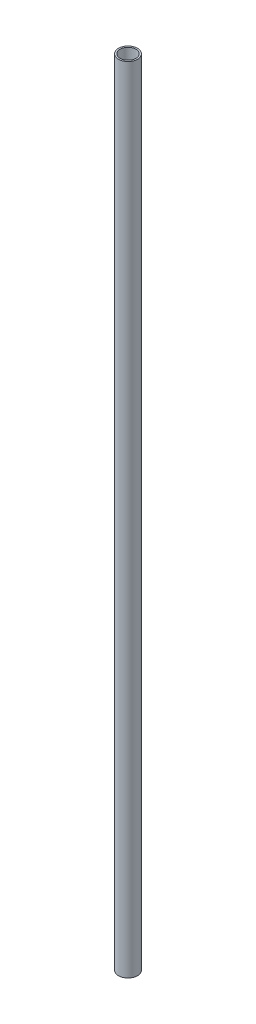
ISO-10303-21;
HEADER;
FILE_DESCRIPTION(('STEP AP214'),'2;1');
FILE_NAME('part.step','',(''),(''),'','','');
FILE_SCHEMA(('AUTOMOTIVE_DESIGN { 1 0 10303 214 1 1 1 1 }'));
ENDSEC;
DATA;
#1=APPLICATION_CONTEXT('core data for automotive mechanical design processes');
#2=APPLICATION_PROTOCOL_DEFINITION('international standard','automotive_design',2000,#1);
#3=PRODUCT_CONTEXT('',#1,'mechanical');
#4=PRODUCT('Part','Part','',(#3));
#5=PRODUCT_RELATED_PRODUCT_CATEGORY('part','',(#4));
#6=PRODUCT_DEFINITION_FORMATION('','',#4);
#7=PRODUCT_DEFINITION_CONTEXT('part definition',#1,'design');
#8=PRODUCT_DEFINITION('design','',#6,#7);
#9=PRODUCT_DEFINITION_SHAPE('','',#8);
#10=(LENGTH_UNIT() NAMED_UNIT(*) SI_UNIT(.MILLI.,.METRE.));
#11=(NAMED_UNIT(*) PLANE_ANGLE_UNIT() SI_UNIT($,.RADIAN.));
#12=(NAMED_UNIT(*) SI_UNIT($,.STERADIAN.) SOLID_ANGLE_UNIT());
#13=UNCERTAINTY_MEASURE_WITH_UNIT(LENGTH_MEASURE(1.E-05),#10,'distance_accuracy_value','');
#14=(GEOMETRIC_REPRESENTATION_CONTEXT(3) GLOBAL_UNCERTAINTY_ASSIGNED_CONTEXT((#13)) GLOBAL_UNIT_ASSIGNED_CONTEXT((#10,
#11,#12)) REPRESENTATION_CONTEXT('',''));
#15=CARTESIAN_POINT('',(0.,0.,0.));
#16=DIRECTION('',(0.,0.,1.));
#17=DIRECTION('',(1.,0.,0.));
#18=AXIS2_PLACEMENT_3D('',#15,#16,#17);
#19=CARTESIAN_POINT('',(0.,500.,0.));
#20=DIRECTION('',(0.,1.,0.));
#21=DIRECTION('',(0.,0.,1.));
#22=AXIS2_PLACEMENT_3D('',#19,#20,#21);
#23=PLANE('',#22);
#24=CARTESIAN_POINT('',(0.,500.,0.));
#25=DIRECTION('',(0.,1.,0.));
#26=DIRECTION('',(0.,0.,1.));
#27=AXIS2_PLACEMENT_3D('',#24,#25,#26);
#28=CIRCLE('',#27,6.);
#29=CARTESIAN_POINT('',(0.,500.,6.));
#30=VERTEX_POINT('',#29);
#31=EDGE_CURVE('E10',#30,#30,#28,.T.);
#32=ORIENTED_EDGE('',*,*,#31,.T.);
#33=EDGE_LOOP('',(#32));
#34=FACE_BOUND('',#33,.T.);
#35=CARTESIAN_POINT('',(0.,500.,0.));
#36=DIRECTION('',(0.,1.,0.));
#37=DIRECTION('',(0.,0.,1.));
#38=AXIS2_PLACEMENT_3D('',#35,#36,#37);
#39=CIRCLE('',#38,5.);
#40=CARTESIAN_POINT('',(0.,500.,5.));
#41=VERTEX_POINT('',#40);
#42=EDGE_CURVE('E44',#41,#41,#39,.T.);
#43=ORIENTED_EDGE('',*,*,#42,.F.);
#44=EDGE_LOOP('',(#43));
#45=FACE_BOUND('',#44,.T.);
#46=ADVANCED_FACE('F33',(#34,#45),#23,.T.);
#47=CARTESIAN_POINT('',(0.,0.,0.));
#48=DIRECTION('',(0.,1.,0.));
#49=DIRECTION('',(0.,0.,1.));
#50=AXIS2_PLACEMENT_3D('',#47,#48,#49);
#51=PLANE('',#50);
#52=CARTESIAN_POINT('',(0.,0.,0.));
#53=DIRECTION('',(0.,1.,0.));
#54=DIRECTION('',(0.,0.,1.));
#55=AXIS2_PLACEMENT_3D('',#52,#53,#54);
#56=CIRCLE('',#55,6.);
#57=CARTESIAN_POINT('',(0.,0.,6.));
#58=VERTEX_POINT('',#57);
#59=EDGE_CURVE('E37',#58,#58,#56,.T.);
#60=ORIENTED_EDGE('',*,*,#59,.F.);
#61=EDGE_LOOP('',(#60));
#62=FACE_BOUND('',#61,.T.);
#63=CARTESIAN_POINT('',(0.,0.,0.));
#64=DIRECTION('',(0.,1.,0.));
#65=DIRECTION('',(0.,0.,1.));
#66=AXIS2_PLACEMENT_3D('',#63,#64,#65);
#67=CIRCLE('',#66,5.);
#68=CARTESIAN_POINT('',(0.,0.,5.));
#69=VERTEX_POINT('',#68);
#70=EDGE_CURVE('E46',#69,#69,#67,.T.);
#71=ORIENTED_EDGE('',*,*,#70,.T.);
#72=EDGE_LOOP('',(#71));
#73=FACE_BOUND('',#72,.T.);
#74=ADVANCED_FACE('F56',(#62,#73),#51,.F.);
#75=CARTESIAN_POINT('',(0.,500.,0.));
#76=DIRECTION('',(0.,-1.,0.));
#77=DIRECTION('',(0.,0.,-1.));
#78=AXIS2_PLACEMENT_3D('',#75,#76,#77);
#79=CYLINDRICAL_SURFACE('',#78,6.);
#80=ORIENTED_EDGE('',*,*,#31,.F.);
#81=EDGE_LOOP('',(#80));
#82=FACE_BOUND('',#81,.T.);
#83=ORIENTED_EDGE('',*,*,#59,.T.);
#84=EDGE_LOOP('',(#83));
#85=FACE_BOUND('',#84,.T.);
#86=ADVANCED_FACE('F35',(#82,#85),#79,.T.);
#87=CARTESIAN_POINT('',(0.,500.,0.));
#88=DIRECTION('',(0.,-1.,0.));
#89=DIRECTION('',(0.,0.,-1.));
#90=AXIS2_PLACEMENT_3D('',#87,#88,#89);
#91=CYLINDRICAL_SURFACE('',#90,5.);
#92=ORIENTED_EDGE('',*,*,#42,.T.);
#93=EDGE_LOOP('',(#92));
#94=FACE_BOUND('',#93,.T.);
#95=ORIENTED_EDGE('',*,*,#70,.F.);
#96=EDGE_LOOP('',(#95));
#97=FACE_BOUND('',#96,.T.);
#98=ADVANCED_FACE('F52',(#94,#97),#91,.F.);
#99=CLOSED_SHELL('',(#46,#74,#86,#98));
#100=MANIFOLD_SOLID_BREP('B2',#99);
#101=ADVANCED_BREP_SHAPE_REPRESENTATION('',(#18,#100),#14);
#102=SHAPE_DEFINITION_REPRESENTATION(#9,#101);
ENDSEC;
END-ISO-10303-21;
